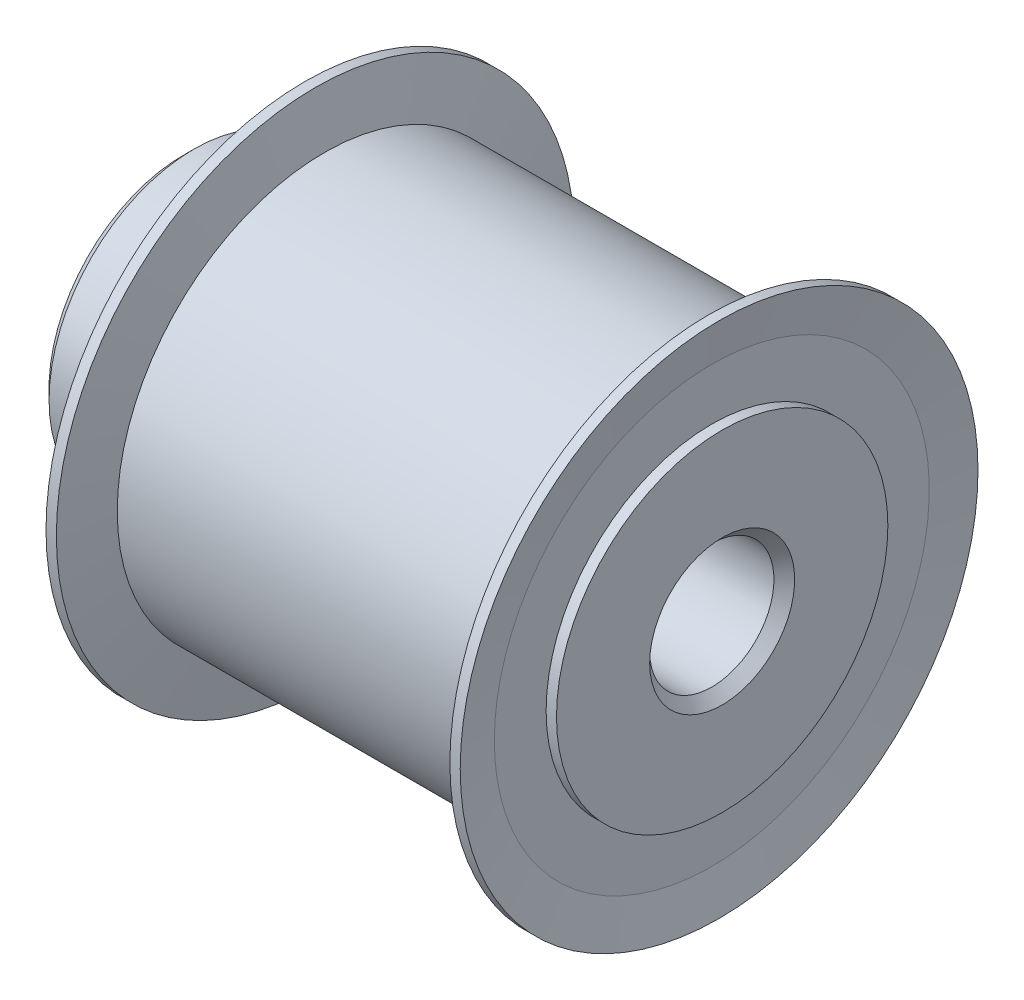
ISO-10303-21;
HEADER;
FILE_DESCRIPTION(('STEP AP214'),'2;1');
FILE_NAME('part.step','',(''),(''),'','','');
FILE_SCHEMA(('AUTOMOTIVE_DESIGN { 1 0 10303 214 1 1 1 1 }'));
ENDSEC;
DATA;
#1=APPLICATION_CONTEXT('core data for automotive mechanical design processes');
#2=APPLICATION_PROTOCOL_DEFINITION('international standard','automotive_design',2000,#1);
#3=PRODUCT_CONTEXT('',#1,'mechanical');
#4=PRODUCT('Part','Part','',(#3));
#5=PRODUCT_RELATED_PRODUCT_CATEGORY('part','',(#4));
#6=PRODUCT_DEFINITION_FORMATION('','',#4);
#7=PRODUCT_DEFINITION_CONTEXT('part definition',#1,'design');
#8=PRODUCT_DEFINITION('design','',#6,#7);
#9=PRODUCT_DEFINITION_SHAPE('','',#8);
#10=(LENGTH_UNIT() NAMED_UNIT(*) SI_UNIT(.MILLI.,.METRE.));
#11=(NAMED_UNIT(*) PLANE_ANGLE_UNIT() SI_UNIT($,.RADIAN.));
#12=(NAMED_UNIT(*) SI_UNIT($,.STERADIAN.) SOLID_ANGLE_UNIT());
#13=UNCERTAINTY_MEASURE_WITH_UNIT(LENGTH_MEASURE(1.E-05),#10,'distance_accuracy_value','');
#14=(GEOMETRIC_REPRESENTATION_CONTEXT(3) GLOBAL_UNCERTAINTY_ASSIGNED_CONTEXT((#13)) GLOBAL_UNIT_ASSIGNED_CONTEXT((#10,
#11,#12)) REPRESENTATION_CONTEXT('',''));
#15=CARTESIAN_POINT('',(0.,0.,0.));
#16=DIRECTION('',(0.,0.,1.));
#17=DIRECTION('',(1.,0.,0.));
#18=AXIS2_PLACEMENT_3D('',#15,#16,#17);
#19=CARTESIAN_POINT('',(0.,3.,0.));
#20=DIRECTION('',(1.,0.,0.));
#21=DIRECTION('',(0.,0.,-1.));
#22=AXIS2_PLACEMENT_3D('',#19,#20,#21);
#23=PLANE('',#22);
#24=CARTESIAN_POINT('',(0.,0.,0.));
#25=DIRECTION('',(1.,0.,0.));
#26=DIRECTION('',(0.,0.,-1.));
#27=AXIS2_PLACEMENT_3D('',#24,#25,#26);
#28=CIRCLE('',#27,3.50000000000001);
#29=CARTESIAN_POINT('',(0.,0.,-3.50000000000001));
#30=VERTEX_POINT('',#29);
#31=EDGE_CURVE('E54',#30,#30,#28,.T.);
#32=ORIENTED_EDGE('',*,*,#31,.T.);
#33=EDGE_LOOP('',(#32));
#34=FACE_BOUND('',#33,.T.);
#35=CARTESIAN_POINT('',(0.,0.,0.));
#36=DIRECTION('',(1.,0.,0.));
#37=DIRECTION('',(0.,0.,-1.));
#38=AXIS2_PLACEMENT_3D('',#35,#36,#37);
#39=CIRCLE('',#38,6.50000000000001);
#40=CARTESIAN_POINT('',(0.,0.,-6.50000000000001));
#41=VERTEX_POINT('',#40);
#42=EDGE_CURVE('E59',#41,#41,#39,.F.);
#43=ORIENTED_EDGE('',*,*,#42,.T.);
#44=EDGE_LOOP('',(#43));
#45=FACE_BOUND('',#44,.T.);
#46=ADVANCED_FACE('F45',(#34,#45),#23,.F.);
#47=CARTESIAN_POINT('',(0.,0.,0.));
#48=DIRECTION('',(-1.,0.,0.));
#49=DIRECTION('',(0.,0.,1.));
#50=AXIS2_PLACEMENT_3D('',#47,#48,#49);
#51=CYLINDRICAL_SURFACE('',#50,7.);
#52=CARTESIAN_POINT('',(0.499999999999998,0.,0.));
#53=DIRECTION('',(1.,0.,0.));
#54=DIRECTION('',(0.,0.,-1.));
#55=AXIS2_PLACEMENT_3D('',#52,#53,#54);
#56=CIRCLE('',#55,7.);
#57=CARTESIAN_POINT('',(0.499999999999998,0.,-7.));
#58=VERTEX_POINT('',#57);
#59=EDGE_CURVE('E10',#58,#58,#56,.T.);
#60=ORIENTED_EDGE('',*,*,#59,.T.);
#61=EDGE_LOOP('',(#60));
#62=FACE_BOUND('',#61,.T.);
#63=CARTESIAN_POINT('',(5.70530792283386,0.,0.));
#64=DIRECTION('',(-1.,0.,0.));
#65=DIRECTION('',(0.,0.,1.));
#66=AXIS2_PLACEMENT_3D('',#63,#64,#65);
#67=CIRCLE('',#66,7.);
#68=CARTESIAN_POINT('',(5.70530792283386,0.,7.));
#69=VERTEX_POINT('',#68);
#70=EDGE_CURVE('E78',#69,#69,#67,.T.);
#71=ORIENTED_EDGE('',*,*,#70,.T.);
#72=EDGE_LOOP('',(#71));
#73=FACE_BOUND('',#72,.T.);
#74=ADVANCED_FACE('F150',(#62,#73),#51,.T.);
#75=CARTESIAN_POINT('',(5.70530792283386,7.,0.));
#76=DIRECTION('',(1.,0.,0.));
#77=DIRECTION('',(0.,0.,-1.));
#78=AXIS2_PLACEMENT_3D('',#75,#76,#77);
#79=PLANE('',#78);
#80=ORIENTED_EDGE('',*,*,#70,.F.);
#81=EDGE_LOOP('',(#80));
#82=FACE_BOUND('',#81,.T.);
#83=CARTESIAN_POINT('',(5.70530792283386,0.,0.));
#84=DIRECTION('',(-1.,0.,0.));
#85=DIRECTION('',(0.,0.,1.));
#86=AXIS2_PLACEMENT_3D('',#83,#84,#85);
#87=CIRCLE('',#86,8.);
#88=CARTESIAN_POINT('',(5.70530792283386,0.,8.));
#89=VERTEX_POINT('',#88);
#90=EDGE_CURVE('E82',#89,#89,#87,.T.);
#91=ORIENTED_EDGE('',*,*,#90,.T.);
#92=EDGE_LOOP('',(#91));
#93=FACE_BOUND('',#92,.T.);
#94=ADVANCED_FACE('F154',(#82,#93),#79,.F.);
#95=CARTESIAN_POINT('',(0.,0.,0.));
#96=DIRECTION('',(-1.,0.,0.));
#97=DIRECTION('',(0.,0.,1.));
#98=AXIS2_PLACEMENT_3D('',#95,#96,#97);
#99=CYLINDRICAL_SURFACE('',#98,8.);
#100=ORIENTED_EDGE('',*,*,#90,.F.);
#101=EDGE_LOOP('',(#100));
#102=FACE_BOUND('',#101,.T.);
#103=CARTESIAN_POINT('',(6.20530792283386,0.,0.));
#104=DIRECTION('',(-1.,0.,0.));
#105=DIRECTION('',(0.,0.,1.));
#106=AXIS2_PLACEMENT_3D('',#103,#104,#105);
#107=CIRCLE('',#106,8.);
#108=CARTESIAN_POINT('',(6.20530792283386,0.,8.));
#109=VERTEX_POINT('',#108);
#110=EDGE_CURVE('E86',#109,#109,#107,.T.);
#111=ORIENTED_EDGE('',*,*,#110,.T.);
#112=EDGE_LOOP('',(#111));
#113=FACE_BOUND('',#112,.T.);
#114=ADVANCED_FACE('F297',(#102,#113),#99,.T.);
#115=CARTESIAN_POINT('',(6.20530792283386,8.,0.));
#116=DIRECTION('',(1.,0.,0.));
#117=DIRECTION('',(0.,0.,-1.));
#118=AXIS2_PLACEMENT_3D('',#115,#116,#117);
#119=PLANE('',#118);
#120=ORIENTED_EDGE('',*,*,#110,.F.);
#121=EDGE_LOOP('',(#120));
#122=FACE_BOUND('',#121,.T.);
#123=CARTESIAN_POINT('',(6.20530792283386,0.,0.));
#124=DIRECTION('',(-1.,0.,0.));
#125=DIRECTION('',(0.,0.,1.));
#126=AXIS2_PLACEMENT_3D('',#123,#124,#125);
#127=CIRCLE('',#126,10.5);
#128=CARTESIAN_POINT('',(6.20530792283386,0.,10.5));
#129=VERTEX_POINT('',#128);
#130=EDGE_CURVE('E90',#129,#129,#127,.T.);
#131=ORIENTED_EDGE('',*,*,#130,.T.);
#132=EDGE_LOOP('',(#131));
#133=FACE_BOUND('',#132,.T.);
#134=ADVANCED_FACE('F287',(#122,#133),#119,.F.);
#135=CARTESIAN_POINT('',(5.85265396141693,0.,0.));
#136=DIRECTION('',(-1.,0.,0.));
#137=DIRECTION('',(0.,0.,1.));
#138=AXIS2_PLACEMENT_3D('',#135,#136,#137);
#139=CONICAL_SURFACE('',#138,12.5,1.39626340159546);
#140=ORIENTED_EDGE('',*,*,#130,.F.);
#141=EDGE_LOOP('',(#140));
#142=FACE_BOUND('',#141,.T.);
#143=CARTESIAN_POINT('',(5.85265396141693,0.,0.));
#144=DIRECTION('',(-1.,0.,0.));
#145=DIRECTION('',(0.,0.,1.));
#146=AXIS2_PLACEMENT_3D('',#143,#144,#145);
#147=CIRCLE('',#146,12.5);
#148=CARTESIAN_POINT('',(5.85265396141693,0.,12.5));
#149=VERTEX_POINT('',#148);
#150=EDGE_CURVE('E94',#149,#149,#147,.T.);
#151=ORIENTED_EDGE('',*,*,#150,.T.);
#152=EDGE_LOOP('',(#151));
#153=FACE_BOUND('',#152,.T.);
#154=ADVANCED_FACE('F277',(#142,#153),#139,.F.);
#155=CARTESIAN_POINT('',(0.,0.,0.));
#156=DIRECTION('',(-1.,0.,0.));
#157=DIRECTION('',(0.,0.,1.));
#158=AXIS2_PLACEMENT_3D('',#155,#156,#157);
#159=CYLINDRICAL_SURFACE('',#158,12.5);
#160=ORIENTED_EDGE('',*,*,#150,.F.);
#161=EDGE_LOOP('',(#160));
#162=FACE_BOUND('',#161,.T.);
#163=CARTESIAN_POINT('',(6.35265396141693,0.,0.));
#164=DIRECTION('',(-1.,0.,0.));
#165=DIRECTION('',(0.,0.,1.));
#166=AXIS2_PLACEMENT_3D('',#163,#164,#165);
#167=CIRCLE('',#166,12.5);
#168=CARTESIAN_POINT('',(6.35265396141693,0.,12.5));
#169=VERTEX_POINT('',#168);
#170=EDGE_CURVE('E98',#169,#169,#167,.T.);
#171=ORIENTED_EDGE('',*,*,#170,.T.);
#172=EDGE_LOOP('',(#171));
#173=FACE_BOUND('',#172,.T.);
#174=ADVANCED_FACE('F267',(#162,#173),#159,.T.);
#175=CARTESIAN_POINT('',(6.79347141318809,0.,0.));
#176=DIRECTION('',(-1.,0.,0.));
#177=DIRECTION('',(0.,0.,1.));
#178=AXIS2_PLACEMENT_3D('',#175,#176,#177);
#179=CONICAL_SURFACE('',#178,10.,1.39626340159546);
#180=ORIENTED_EDGE('',*,*,#170,.F.);
#181=EDGE_LOOP('',(#180));
#182=FACE_BOUND('',#181,.T.);
#183=CARTESIAN_POINT('',(6.79347141318809,0.,0.));
#184=DIRECTION('',(-1.,0.,0.));
#185=DIRECTION('',(0.,0.,1.));
#186=AXIS2_PLACEMENT_3D('',#183,#184,#185);
#187=CIRCLE('',#186,10.);
#188=CARTESIAN_POINT('',(6.79347141318809,0.,10.));
#189=VERTEX_POINT('',#188);
#190=EDGE_CURVE('E102',#189,#189,#187,.T.);
#191=ORIENTED_EDGE('',*,*,#190,.T.);
#192=EDGE_LOOP('',(#191));
#193=FACE_BOUND('',#192,.T.);
#194=ADVANCED_FACE('F257',(#182,#193),#179,.T.);
#195=CARTESIAN_POINT('',(0.,0.,0.));
#196=DIRECTION('',(-1.,0.,0.));
#197=DIRECTION('',(0.,0.,1.));
#198=AXIS2_PLACEMENT_3D('',#195,#196,#197);
#199=CYLINDRICAL_SURFACE('',#198,10.);
#200=ORIENTED_EDGE('',*,*,#190,.F.);
#201=EDGE_LOOP('',(#200));
#202=FACE_BOUND('',#201,.T.);
#203=CARTESIAN_POINT('',(24.9118365096458,0.,0.));
#204=DIRECTION('',(-1.,0.,0.));
#205=DIRECTION('',(0.,0.,1.));
#206=AXIS2_PLACEMENT_3D('',#203,#204,#205);
#207=CIRCLE('',#206,10.);
#208=CARTESIAN_POINT('',(24.9118365096458,0.,10.));
#209=VERTEX_POINT('',#208);
#210=EDGE_CURVE('E106',#209,#209,#207,.T.);
#211=ORIENTED_EDGE('',*,*,#210,.T.);
#212=EDGE_LOOP('',(#211));
#213=FACE_BOUND('',#212,.T.);
#214=ADVANCED_FACE('F247',(#202,#213),#199,.T.);
#215=CARTESIAN_POINT('',(25.3526539614169,0.,0.));
#216=DIRECTION('',(1.,0.,0.));
#217=DIRECTION('',(0.,0.,-1.));
#218=AXIS2_PLACEMENT_3D('',#215,#216,#217);
#219=CONICAL_SURFACE('',#218,12.5,1.39626340159546);
#220=ORIENTED_EDGE('',*,*,#210,.F.);
#221=EDGE_LOOP('',(#220));
#222=FACE_BOUND('',#221,.T.);
#223=CARTESIAN_POINT('',(25.3526539614169,0.,0.));
#224=DIRECTION('',(-1.,0.,0.));
#225=DIRECTION('',(0.,0.,1.));
#226=AXIS2_PLACEMENT_3D('',#223,#224,#225);
#227=CIRCLE('',#226,12.5);
#228=CARTESIAN_POINT('',(25.3526539614169,0.,12.5));
#229=VERTEX_POINT('',#228);
#230=EDGE_CURVE('E110',#229,#229,#227,.T.);
#231=ORIENTED_EDGE('',*,*,#230,.T.);
#232=EDGE_LOOP('',(#231));
#233=FACE_BOUND('',#232,.T.);
#234=ADVANCED_FACE('F237',(#222,#233),#219,.T.);
#235=CARTESIAN_POINT('',(0.,0.,0.));
#236=DIRECTION('',(-1.,0.,0.));
#237=DIRECTION('',(0.,0.,1.));
#238=AXIS2_PLACEMENT_3D('',#235,#236,#237);
#239=CYLINDRICAL_SURFACE('',#238,12.5);
#240=ORIENTED_EDGE('',*,*,#230,.F.);
#241=EDGE_LOOP('',(#240));
#242=FACE_BOUND('',#241,.T.);
#243=CARTESIAN_POINT('',(25.8526539614169,0.,0.));
#244=DIRECTION('',(-1.,0.,0.));
#245=DIRECTION('',(0.,0.,1.));
#246=AXIS2_PLACEMENT_3D('',#243,#244,#245);
#247=CIRCLE('',#246,12.5);
#248=CARTESIAN_POINT('',(25.8526539614169,0.,12.5));
#249=VERTEX_POINT('',#248);
#250=EDGE_CURVE('E114',#249,#249,#247,.T.);
#251=ORIENTED_EDGE('',*,*,#250,.T.);
#252=EDGE_LOOP('',(#251));
#253=FACE_BOUND('',#252,.T.);
#254=ADVANCED_FACE('F227',(#242,#253),#239,.T.);
#255=CARTESIAN_POINT('',(25.5,0.,0.));
#256=DIRECTION('',(1.,0.,0.));
#257=DIRECTION('',(0.,0.,-1.));
#258=AXIS2_PLACEMENT_3D('',#255,#256,#257);
#259=CONICAL_SURFACE('',#258,10.5,1.39626340159546);
#260=ORIENTED_EDGE('',*,*,#250,.F.);
#261=EDGE_LOOP('',(#260));
#262=FACE_BOUND('',#261,.T.);
#263=CARTESIAN_POINT('',(25.5,0.,0.));
#264=DIRECTION('',(-1.,0.,0.));
#265=DIRECTION('',(0.,0.,1.));
#266=AXIS2_PLACEMENT_3D('',#263,#264,#265);
#267=CIRCLE('',#266,10.5);
#268=CARTESIAN_POINT('',(25.5,0.,10.5));
#269=VERTEX_POINT('',#268);
#270=EDGE_CURVE('E118',#269,#269,#267,.T.);
#271=ORIENTED_EDGE('',*,*,#270,.T.);
#272=EDGE_LOOP('',(#271));
#273=FACE_BOUND('',#272,.T.);
#274=ADVANCED_FACE('F217',(#262,#273),#259,.F.);
#275=CARTESIAN_POINT('',(25.5,10.5,0.));
#276=DIRECTION('',(-1.,0.,0.));
#277=DIRECTION('',(0.,0.,1.));
#278=AXIS2_PLACEMENT_3D('',#275,#276,#277);
#279=PLANE('',#278);
#280=ORIENTED_EDGE('',*,*,#270,.F.);
#281=EDGE_LOOP('',(#280));
#282=FACE_BOUND('',#281,.T.);
#283=CARTESIAN_POINT('',(25.5,0.,0.));
#284=DIRECTION('',(-1.,0.,0.));
#285=DIRECTION('',(0.,0.,1.));
#286=AXIS2_PLACEMENT_3D('',#283,#284,#285);
#287=CIRCLE('',#286,8.);
#288=CARTESIAN_POINT('',(25.5,0.,8.));
#289=VERTEX_POINT('',#288);
#290=EDGE_CURVE('E122',#289,#289,#287,.T.);
#291=ORIENTED_EDGE('',*,*,#290,.T.);
#292=EDGE_LOOP('',(#291));
#293=FACE_BOUND('',#292,.T.);
#294=ADVANCED_FACE('F146',(#282,#293),#279,.F.);
#295=CARTESIAN_POINT('',(0.,0.,0.));
#296=DIRECTION('',(-1.,0.,0.));
#297=DIRECTION('',(0.,0.,1.));
#298=AXIS2_PLACEMENT_3D('',#295,#296,#297);
#299=CYLINDRICAL_SURFACE('',#298,8.);
#300=ORIENTED_EDGE('',*,*,#290,.F.);
#301=EDGE_LOOP('',(#300));
#302=FACE_BOUND('',#301,.T.);
#303=CARTESIAN_POINT('',(26.,0.,0.));
#304=DIRECTION('',(-1.,0.,0.));
#305=DIRECTION('',(0.,0.,1.));
#306=AXIS2_PLACEMENT_3D('',#303,#304,#305);
#307=CIRCLE('',#306,8.);
#308=CARTESIAN_POINT('',(26.,0.,8.));
#309=VERTEX_POINT('',#308);
#310=EDGE_CURVE('E126',#309,#309,#307,.T.);
#311=ORIENTED_EDGE('',*,*,#310,.T.);
#312=EDGE_LOOP('',(#311));
#313=FACE_BOUND('',#312,.T.);
#314=ADVANCED_FACE('F131',(#302,#313),#299,.T.);
#315=CARTESIAN_POINT('',(26.,8.,0.));
#316=DIRECTION('',(-1.,0.,0.));
#317=DIRECTION('',(0.,0.,1.));
#318=AXIS2_PLACEMENT_3D('',#315,#316,#317);
#319=PLANE('',#318);
#320=CARTESIAN_POINT('',(26.,0.,0.));
#321=DIRECTION('',(-1.,0.,0.));
#322=DIRECTION('',(0.,0.,1.));
#323=AXIS2_PLACEMENT_3D('',#320,#321,#322);
#324=CIRCLE('',#323,3.50000000000001);
#325=CARTESIAN_POINT('',(26.,0.,3.50000000000001));
#326=VERTEX_POINT('',#325);
#327=EDGE_CURVE('E74',#326,#326,#324,.T.);
#328=ORIENTED_EDGE('',*,*,#327,.T.);
#329=EDGE_LOOP('',(#328));
#330=FACE_BOUND('',#329,.T.);
#331=ORIENTED_EDGE('',*,*,#310,.F.);
#332=EDGE_LOOP('',(#331));
#333=FACE_BOUND('',#332,.T.);
#334=ADVANCED_FACE('F133',(#330,#333),#319,.F.);
#335=CARTESIAN_POINT('',(0.,0.,0.));
#336=DIRECTION('',(-1.,0.,0.));
#337=DIRECTION('',(0.,0.,1.));
#338=AXIS2_PLACEMENT_3D('',#335,#336,#337);
#339=CYLINDRICAL_SURFACE('',#338,3.);
#340=CARTESIAN_POINT('',(25.5,0.,0.));
#341=DIRECTION('',(-1.,0.,0.));
#342=DIRECTION('',(0.,0.,1.));
#343=AXIS2_PLACEMENT_3D('',#340,#341,#342);
#344=CIRCLE('',#343,3.);
#345=CARTESIAN_POINT('',(25.5,0.,3.));
#346=VERTEX_POINT('',#345);
#347=EDGE_CURVE('E64',#346,#346,#344,.F.);
#348=ORIENTED_EDGE('',*,*,#347,.T.);
#349=EDGE_LOOP('',(#348));
#350=FACE_BOUND('',#349,.T.);
#351=CARTESIAN_POINT('',(0.500000000000006,0.,0.));
#352=DIRECTION('',(1.,0.,0.));
#353=DIRECTION('',(0.,0.,-1.));
#354=AXIS2_PLACEMENT_3D('',#351,#352,#353);
#355=CIRCLE('',#354,3.);
#356=CARTESIAN_POINT('',(0.500000000000006,0.,-3.));
#357=VERTEX_POINT('',#356);
#358=EDGE_CURVE('E70',#357,#357,#355,.F.);
#359=ORIENTED_EDGE('',*,*,#358,.T.);
#360=EDGE_LOOP('',(#359));
#361=FACE_BOUND('',#360,.T.);
#362=ADVANCED_FACE('F135',(#350,#361),#339,.F.);
#363=CARTESIAN_POINT('',(26.,0.,0.));
#364=DIRECTION('',(1.,0.,0.));
#365=DIRECTION('',(0.,0.,-1.));
#366=AXIS2_PLACEMENT_3D('',#363,#364,#365);
#367=CONICAL_SURFACE('',#366,3.50000000000001,0.785398163397444);
#368=ORIENTED_EDGE('',*,*,#347,.F.);
#369=EDGE_LOOP('',(#368));
#370=FACE_BOUND('',#369,.T.);
#371=ORIENTED_EDGE('',*,*,#327,.F.);
#372=EDGE_LOOP('',(#371));
#373=FACE_BOUND('',#372,.T.);
#374=ADVANCED_FACE('F142',(#370,#373),#367,.F.);
#375=CARTESIAN_POINT('',(0.500000000000006,0.,0.));
#376=DIRECTION('',(-1.,0.,0.));
#377=DIRECTION('',(0.,0.,1.));
#378=AXIS2_PLACEMENT_3D('',#375,#376,#377);
#379=CONICAL_SURFACE('',#378,3.,0.785398163397449);
#380=ORIENTED_EDGE('',*,*,#31,.F.);
#381=EDGE_LOOP('',(#380));
#382=FACE_BOUND('',#381,.T.);
#383=ORIENTED_EDGE('',*,*,#358,.F.);
#384=EDGE_LOOP('',(#383));
#385=FACE_BOUND('',#384,.T.);
#386=ADVANCED_FACE('F164',(#382,#385),#379,.F.);
#387=CARTESIAN_POINT('',(0.,0.,0.));
#388=DIRECTION('',(1.,0.,0.));
#389=DIRECTION('',(0.,0.,-1.));
#390=AXIS2_PLACEMENT_3D('',#387,#388,#389);
#391=CONICAL_SURFACE('',#390,6.50000000000001,0.785398163397445);
#392=ORIENTED_EDGE('',*,*,#59,.F.);
#393=EDGE_LOOP('',(#392));
#394=FACE_BOUND('',#393,.T.);
#395=ORIENTED_EDGE('',*,*,#42,.F.);
#396=EDGE_LOOP('',(#395));
#397=FACE_BOUND('',#396,.T.);
#398=ADVANCED_FACE('F48',(#394,#397),#391,.T.);
#399=CLOSED_SHELL('',(#46,#74,#94,#114,#134,#154,#174,#194,#214,#234,#254,#274,#294,#314,#334,
#362,#374,#386,#398));
#400=MANIFOLD_SOLID_BREP('B2',#399);
#401=ADVANCED_BREP_SHAPE_REPRESENTATION('',(#18,#400),#14);
#402=SHAPE_DEFINITION_REPRESENTATION(#9,#401);
ENDSEC;
END-ISO-10303-21;
